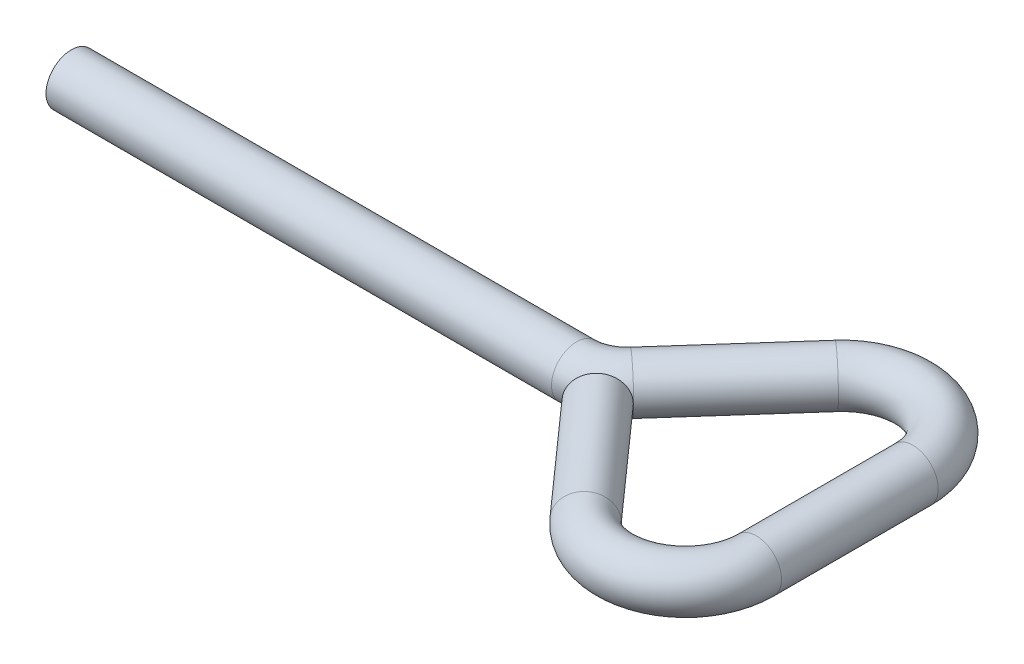
ISO-10303-21;
HEADER;
FILE_DESCRIPTION(('STEP AP214'),'2;1');
FILE_NAME('part.step','',(''),(''),'','','');
FILE_SCHEMA(('AUTOMOTIVE_DESIGN { 1 0 10303 214 1 1 1 1 }'));
ENDSEC;
DATA;
#1=APPLICATION_CONTEXT('core data for automotive mechanical design processes');
#2=APPLICATION_PROTOCOL_DEFINITION('international standard','automotive_design',2000,#1);
#3=PRODUCT_CONTEXT('',#1,'mechanical');
#4=PRODUCT('Part','Part','',(#3));
#5=PRODUCT_RELATED_PRODUCT_CATEGORY('part','',(#4));
#6=PRODUCT_DEFINITION_FORMATION('','',#4);
#7=PRODUCT_DEFINITION_CONTEXT('part definition',#1,'design');
#8=PRODUCT_DEFINITION('design','',#6,#7);
#9=PRODUCT_DEFINITION_SHAPE('','',#8);
#10=(LENGTH_UNIT() NAMED_UNIT(*) SI_UNIT(.MILLI.,.METRE.));
#11=(NAMED_UNIT(*) PLANE_ANGLE_UNIT() SI_UNIT($,.RADIAN.));
#12=(NAMED_UNIT(*) SI_UNIT($,.STERADIAN.) SOLID_ANGLE_UNIT());
#13=UNCERTAINTY_MEASURE_WITH_UNIT(LENGTH_MEASURE(1.E-05),#10,'distance_accuracy_value','');
#14=(GEOMETRIC_REPRESENTATION_CONTEXT(3) GLOBAL_UNCERTAINTY_ASSIGNED_CONTEXT((#13)) GLOBAL_UNIT_ASSIGNED_CONTEXT((#10,
#11,#12)) REPRESENTATION_CONTEXT('',''));
#15=CARTESIAN_POINT('',(0.,0.,0.));
#16=DIRECTION('',(0.,0.,1.));
#17=DIRECTION('',(1.,0.,0.));
#18=AXIS2_PLACEMENT_3D('',#15,#16,#17);
#19=CARTESIAN_POINT('',(-21.76297004077,0.,1.678162092479));
#20=DIRECTION('',(0.664367581504307,0.,0.747405991845208));
#21=DIRECTION('',(0.747405991845208,0.,-0.664367581504307));
#22=AXIS2_PLACEMENT_3D('',#19,#20,#21);
#23=PLANE('',#22);
#24=CARTESIAN_POINT('',(-21.7629700407715,0.,1.67816209247731));
#25=DIRECTION('',(0.664367581504307,0.,0.747405991845208));
#26=DIRECTION('',(0.747405991845208,0.,-0.664367581504307));
#27=AXIS2_PLACEMENT_3D('',#24,#25,#26);
#28=CIRCLE('',#27,2.5);
#29=CARTESIAN_POINT('',(-19.8944550611585,0.,0.0172431387165477));
#30=VERTEX_POINT('',#29);
#31=EDGE_CURVE('E18',#30,#30,#28,.T.);
#32=ORIENTED_EDGE('',*,*,#31,.F.);
#33=EDGE_LOOP('',(#32));
#34=FACE_BOUND('',#33,.T.);
#35=ADVANCED_FACE('F15',(#34),#23,.F.);
#36=CARTESIAN_POINT('',(-21.76297004077,0.,1.678162092479));
#37=DIRECTION('',(0.664367581504307,0.,0.747405991845208));
#38=DIRECTION('',(0.747405991845208,0.,-0.664367581504307));
#39=AXIS2_PLACEMENT_3D('',#36,#37,#38);
#40=CYLINDRICAL_SURFACE('',#39,2.5);
#41=CARTESIAN_POINT('',(-12.2318419429136,0.,12.4005730705333));
#42=DIRECTION('',(0.664367581504762,0.,0.747405991844803));
#43=DIRECTION('',(-0.747405991844803,0.,0.664367581504762));
#44=AXIS2_PLACEMENT_3D('',#41,#42,#43);
#45=CIRCLE('',#44,2.5);
#46=CARTESIAN_POINT('',(-14.1003569225256,0.,14.0614920242952));
#47=VERTEX_POINT('',#46);
#48=EDGE_CURVE('E60',#47,#47,#45,.T.);
#49=ORIENTED_EDGE('',*,*,#48,.F.);
#50=EDGE_LOOP('',(#49));
#51=FACE_BOUND('',#50,.T.);
#52=ORIENTED_EDGE('',*,*,#31,.T.);
#53=EDGE_LOOP('',(#52));
#54=FACE_BOUND('',#53,.T.);
#55=ADVANCED_FACE('F52',(#51,#54),#40,.T.);
#56=CARTESIAN_POINT('',(-7.,0.,7.75));
#57=DIRECTION('',(0.,1.,0.));
#58=DIRECTION('',(0.747405991845208,0.,-0.664367581504307));
#59=AXIS2_PLACEMENT_3D('',#56,#57,#58);
#60=TOROIDAL_SURFACE('',#59,7.,2.5);
#61=CARTESIAN_POINT('',(0.,0.,7.75));
#62=DIRECTION('',(0.,0.,-1.));
#63=DIRECTION('',(-1.,0.,0.));
#64=AXIS2_PLACEMENT_3D('',#61,#62,#63);
#65=CIRCLE('',#64,2.5);
#66=CARTESIAN_POINT('',(-2.5,0.,7.75));
#67=VERTEX_POINT('',#66);
#68=EDGE_CURVE('E57',#67,#67,#65,.T.);
#69=ORIENTED_EDGE('',*,*,#68,.F.);
#70=EDGE_LOOP('',(#69));
#71=FACE_BOUND('',#70,.T.);
#72=ORIENTED_EDGE('',*,*,#48,.T.);
#73=EDGE_LOOP('',(#72));
#74=FACE_BOUND('',#73,.T.);
#75=ADVANCED_FACE('F48',(#71,#74),#60,.T.);
#76=CARTESIAN_POINT('',(0.,0.,7.75));
#77=DIRECTION('',(0.,0.,-1.));
#78=DIRECTION('',(-1.,0.,0.));
#79=AXIS2_PLACEMENT_3D('',#76,#77,#78);
#80=CYLINDRICAL_SURFACE('',#79,2.5);
#81=CARTESIAN_POINT('',(0.,0.,-7.75));
#82=DIRECTION('',(0.,0.,-1.));
#83=DIRECTION('',(1.,0.,0.));
#84=AXIS2_PLACEMENT_3D('',#81,#82,#83);
#85=CIRCLE('',#84,2.5);
#86=CARTESIAN_POINT('',(2.5,0.,-7.75));
#87=VERTEX_POINT('',#86);
#88=EDGE_CURVE('E56',#87,#87,#85,.T.);
#89=ORIENTED_EDGE('',*,*,#88,.F.);
#90=EDGE_LOOP('',(#89));
#91=FACE_BOUND('',#90,.T.);
#92=ORIENTED_EDGE('',*,*,#68,.T.);
#93=EDGE_LOOP('',(#92));
#94=FACE_BOUND('',#93,.T.);
#95=ADVANCED_FACE('F43',(#91,#94),#80,.T.);
#96=CARTESIAN_POINT('',(-7.,0.,-7.75));
#97=DIRECTION('',(0.,1.,0.));
#98=DIRECTION('',(-1.,0.,0.));
#99=AXIS2_PLACEMENT_3D('',#96,#97,#98);
#100=TOROIDAL_SURFACE('',#99,7.,2.5);
#101=CARTESIAN_POINT('',(-12.2318419429165,0.,-12.4005730705339));
#102=DIRECTION('',(-0.664367581504307,0.,0.747405991845208));
#103=DIRECTION('',(0.747405991845208,0.,0.664367581504307));
#104=AXIS2_PLACEMENT_3D('',#101,#102,#103);
#105=CIRCLE('',#104,2.5);
#106=CARTESIAN_POINT('',(-10.3633269633035,0.,-10.7396541167731));
#107=VERTEX_POINT('',#106);
#108=EDGE_CURVE('E33',#107,#107,#105,.T.);
#109=ORIENTED_EDGE('',*,*,#108,.F.);
#110=EDGE_LOOP('',(#109));
#111=FACE_BOUND('',#110,.T.);
#112=ORIENTED_EDGE('',*,*,#88,.T.);
#113=EDGE_LOOP('',(#112));
#114=FACE_BOUND('',#113,.T.);
#115=ADVANCED_FACE('F38',(#111,#114),#100,.T.);
#116=CARTESIAN_POINT('',(-12.23184194292,0.,-12.40057307053));
#117=DIRECTION('',(-0.664367581504307,0.,0.747405991845208));
#118=DIRECTION('',(0.747405991845208,0.,0.664367581504307));
#119=AXIS2_PLACEMENT_3D('',#116,#117,#118);
#120=CYLINDRICAL_SURFACE('',#119,2.5);
#121=CARTESIAN_POINT('',(-21.7629700407736,0.,-1.67816209247885));
#122=DIRECTION('',(-0.66436758150423,0.,0.747405991845276));
#123=DIRECTION('',(0.747405991845275,0.,0.66436758150423));
#124=AXIS2_PLACEMENT_3D('',#121,#122,#123);
#125=CIRCLE('',#124,2.5);
#126=CARTESIAN_POINT('',(-19.8944550611604,0.,-0.0172431387182738));
#127=VERTEX_POINT('',#126);
#128=EDGE_CURVE('E27',#127,#127,#125,.T.);
#129=ORIENTED_EDGE('',*,*,#128,.F.);
#130=EDGE_LOOP('',(#129));
#131=FACE_BOUND('',#130,.T.);
#132=ORIENTED_EDGE('',*,*,#108,.T.);
#133=EDGE_LOOP('',(#132));
#134=FACE_BOUND('',#133,.T.);
#135=ADVANCED_FACE('F42',(#131,#134),#120,.T.);
#136=CARTESIAN_POINT('',(-75.5,0.,0.));
#137=DIRECTION('',(-1.,0.,0.));
#138=DIRECTION('',(0.,0.,1.));
#139=AXIS2_PLACEMENT_3D('',#136,#137,#138);
#140=PLANE('',#139);
#141=CARTESIAN_POINT('',(-75.5,0.,0.));
#142=DIRECTION('',(-1.,0.,0.));
#143=DIRECTION('',(0.,0.,1.));
#144=AXIS2_PLACEMENT_3D('',#141,#142,#143);
#145=CIRCLE('',#144,2.5);
#146=CARTESIAN_POINT('',(-75.5,0.,2.5));
#147=VERTEX_POINT('',#146);
#148=EDGE_CURVE('E22',#147,#147,#145,.F.);
#149=ORIENTED_EDGE('',*,*,#148,.F.);
#150=EDGE_LOOP('',(#149));
#151=FACE_BOUND('',#150,.T.);
#152=ADVANCED_FACE('F82',(#151),#140,.T.);
#153=CARTESIAN_POINT('',(-25.5,0.,-5.));
#154=DIRECTION('',(0.,-1.,0.));
#155=DIRECTION('',(-0.747405991845208,0.,-0.664367581504307));
#156=AXIS2_PLACEMENT_3D('',#153,#154,#155);
#157=TOROIDAL_SURFACE('',#156,5.,2.5);
#158=CARTESIAN_POINT('',(-25.5,0.,0.));
#159=DIRECTION('',(-1.,0.,0.));
#160=DIRECTION('',(0.,0.,1.));
#161=AXIS2_PLACEMENT_3D('',#158,#159,#160);
#162=CIRCLE('',#161,2.5);
#163=CARTESIAN_POINT('',(-25.5,0.,2.5));
#164=VERTEX_POINT('',#163);
#165=EDGE_CURVE('E10',#164,#164,#162,.T.);
#166=ORIENTED_EDGE('',*,*,#165,.F.);
#167=EDGE_LOOP('',(#166));
#168=FACE_BOUND('',#167,.T.);
#169=ORIENTED_EDGE('',*,*,#128,.T.);
#170=EDGE_LOOP('',(#169));
#171=FACE_BOUND('',#170,.T.);
#172=ADVANCED_FACE('F76',(#168,#171),#157,.T.);
#173=CARTESIAN_POINT('',(-25.5,0.,0.));
#174=DIRECTION('',(-1.,0.,0.));
#175=DIRECTION('',(0.,0.,1.));
#176=AXIS2_PLACEMENT_3D('',#173,#174,#175);
#177=CYLINDRICAL_SURFACE('',#176,2.5);
#178=ORIENTED_EDGE('',*,*,#148,.T.);
#179=EDGE_LOOP('',(#178));
#180=FACE_BOUND('',#179,.T.);
#181=ORIENTED_EDGE('',*,*,#165,.T.);
#182=EDGE_LOOP('',(#181));
#183=FACE_BOUND('',#182,.T.);
#184=ADVANCED_FACE('F74',(#180,#183),#177,.T.);
#185=CLOSED_SHELL('',(#35,#55,#75,#95,#115,#135,#152,#172,#184));
#186=MANIFOLD_SOLID_BREP('B1',#185);
#187=ADVANCED_BREP_SHAPE_REPRESENTATION('',(#18,#186),#14);
#188=SHAPE_DEFINITION_REPRESENTATION(#9,#187);
ENDSEC;
END-ISO-10303-21;
